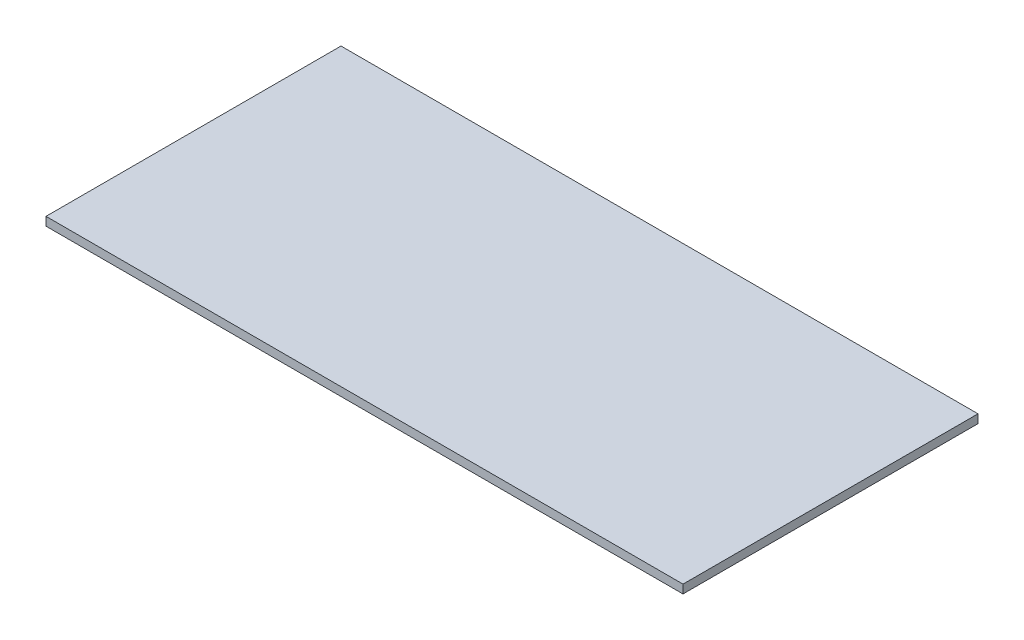
ISO-10303-21;
HEADER;
FILE_DESCRIPTION(('STEP AP214'),'2;1');
FILE_NAME('part.step','',(''),(''),'','','');
FILE_SCHEMA(('AUTOMOTIVE_DESIGN { 1 0 10303 214 1 1 1 1 }'));
ENDSEC;
DATA;
#1=APPLICATION_CONTEXT('core data for automotive mechanical design processes');
#2=APPLICATION_PROTOCOL_DEFINITION('international standard','automotive_design',2000,#1);
#3=PRODUCT_CONTEXT('',#1,'mechanical');
#4=PRODUCT('Part','Part','',(#3));
#5=PRODUCT_RELATED_PRODUCT_CATEGORY('part','',(#4));
#6=PRODUCT_DEFINITION_FORMATION('','',#4);
#7=PRODUCT_DEFINITION_CONTEXT('part definition',#1,'design');
#8=PRODUCT_DEFINITION('design','',#6,#7);
#9=PRODUCT_DEFINITION_SHAPE('','',#8);
#10=(LENGTH_UNIT() NAMED_UNIT(*) SI_UNIT(.MILLI.,.METRE.));
#11=(NAMED_UNIT(*) PLANE_ANGLE_UNIT() SI_UNIT($,.RADIAN.));
#12=(NAMED_UNIT(*) SI_UNIT($,.STERADIAN.) SOLID_ANGLE_UNIT());
#13=UNCERTAINTY_MEASURE_WITH_UNIT(LENGTH_MEASURE(1.E-05),#10,'distance_accuracy_value','');
#14=(GEOMETRIC_REPRESENTATION_CONTEXT(3) GLOBAL_UNCERTAINTY_ASSIGNED_CONTEXT((#13)) GLOBAL_UNIT_ASSIGNED_CONTEXT((#10,
#11,#12)) REPRESENTATION_CONTEXT('',''));
#15=CARTESIAN_POINT('',(0.,0.,0.));
#16=DIRECTION('',(0.,0.,1.));
#17=DIRECTION('',(1.,0.,0.));
#18=AXIS2_PLACEMENT_3D('',#15,#16,#17);
#19=CARTESIAN_POINT('',(94.615,2.54,43.815));
#20=DIRECTION('',(-1.,0.,0.));
#21=DIRECTION('',(0.,0.,1.));
#22=AXIS2_PLACEMENT_3D('',#19,#20,#21);
#23=PLANE('',#22);
#24=DIRECTION('',(0.,0.,-1.));
#25=VECTOR('',#24,1.);
#26=CARTESIAN_POINT('',(94.615,0.,43.815));
#27=LINE('',#26,#25);
#28=CARTESIAN_POINT('',(94.615,0.,43.815));
#29=VERTEX_POINT('',#28);
#30=CARTESIAN_POINT('',(94.615,0.,-43.815));
#31=VERTEX_POINT('',#30);
#32=EDGE_CURVE('E107',#29,#31,#27,.T.);
#33=ORIENTED_EDGE('',*,*,#32,.T.);
#34=DIRECTION('',(0.,-1.,0.));
#35=VECTOR('',#34,1.);
#36=CARTESIAN_POINT('',(94.615,2.54,-43.815));
#37=LINE('',#36,#35);
#38=CARTESIAN_POINT('',(94.615,2.54,-43.815));
#39=VERTEX_POINT('',#38);
#40=EDGE_CURVE('E11',#39,#31,#37,.T.);
#41=ORIENTED_EDGE('',*,*,#40,.F.);
#42=DIRECTION('',(0.,0.,-1.));
#43=VECTOR('',#42,1.);
#44=CARTESIAN_POINT('',(94.615,2.54,43.815));
#45=LINE('',#44,#43);
#46=CARTESIAN_POINT('',(94.615,2.54,43.815));
#47=VERTEX_POINT('',#46);
#48=EDGE_CURVE('E91',#47,#39,#45,.T.);
#49=ORIENTED_EDGE('',*,*,#48,.F.);
#50=DIRECTION('',(0.,-1.,0.));
#51=VECTOR('',#50,1.);
#52=CARTESIAN_POINT('',(94.615,2.54,43.815));
#53=LINE('',#52,#51);
#54=EDGE_CURVE('E103',#47,#29,#53,.T.);
#55=ORIENTED_EDGE('',*,*,#54,.T.);
#56=EDGE_LOOP('',(#33,#41,#49,#55));
#57=FACE_BOUND('',#56,.T.);
#58=ADVANCED_FACE('F39',(#57),#23,.F.);
#59=CARTESIAN_POINT('',(-94.615,2.54,-43.815));
#60=DIRECTION('',(0.,0.,1.));
#61=DIRECTION('',(1.,0.,0.));
#62=AXIS2_PLACEMENT_3D('',#59,#60,#61);
#63=PLANE('',#62);
#64=DIRECTION('',(-1.,0.,0.));
#65=VECTOR('',#64,1.);
#66=CARTESIAN_POINT('',(-94.615,0.,-43.815));
#67=LINE('',#66,#65);
#68=CARTESIAN_POINT('',(-94.615,0.,-43.815));
#69=VERTEX_POINT('',#68);
#70=EDGE_CURVE('E96',#31,#69,#67,.T.);
#71=ORIENTED_EDGE('',*,*,#70,.T.);
#72=DIRECTION('',(0.,-1.,0.));
#73=VECTOR('',#72,1.);
#74=CARTESIAN_POINT('',(-94.615,2.54,-43.815));
#75=LINE('',#74,#73);
#76=CARTESIAN_POINT('',(-94.615,2.54,-43.815));
#77=VERTEX_POINT('',#76);
#78=EDGE_CURVE('E48',#77,#69,#75,.T.);
#79=ORIENTED_EDGE('',*,*,#78,.F.);
#80=DIRECTION('',(-1.,0.,0.));
#81=VECTOR('',#80,1.);
#82=CARTESIAN_POINT('',(-94.615,2.54,-43.815));
#83=LINE('',#82,#81);
#84=EDGE_CURVE('E86',#39,#77,#83,.T.);
#85=ORIENTED_EDGE('',*,*,#84,.F.);
#86=ORIENTED_EDGE('',*,*,#40,.T.);
#87=EDGE_LOOP('',(#71,#79,#85,#86));
#88=FACE_BOUND('',#87,.T.);
#89=ADVANCED_FACE('F95',(#88),#63,.F.);
#90=CARTESIAN_POINT('',(-94.615,2.54,43.815));
#91=DIRECTION('',(1.,0.,0.));
#92=DIRECTION('',(0.,0.,-1.));
#93=AXIS2_PLACEMENT_3D('',#90,#91,#92);
#94=PLANE('',#93);
#95=DIRECTION('',(0.,0.,1.));
#96=VECTOR('',#95,1.);
#97=CARTESIAN_POINT('',(-94.615,0.,43.815));
#98=LINE('',#97,#96);
#99=CARTESIAN_POINT('',(-94.615,0.,43.815));
#100=VERTEX_POINT('',#99);
#101=EDGE_CURVE('E73',#69,#100,#98,.T.);
#102=ORIENTED_EDGE('',*,*,#101,.T.);
#103=DIRECTION('',(0.,-1.,0.));
#104=VECTOR('',#103,1.);
#105=CARTESIAN_POINT('',(-94.615,2.54,43.815));
#106=LINE('',#105,#104);
#107=CARTESIAN_POINT('',(-94.615,2.54,43.815));
#108=VERTEX_POINT('',#107);
#109=EDGE_CURVE('E98',#108,#100,#106,.T.);
#110=ORIENTED_EDGE('',*,*,#109,.F.);
#111=DIRECTION('',(0.,0.,1.));
#112=VECTOR('',#111,1.);
#113=CARTESIAN_POINT('',(-94.615,2.54,43.815));
#114=LINE('',#113,#112);
#115=EDGE_CURVE('E89',#77,#108,#114,.T.);
#116=ORIENTED_EDGE('',*,*,#115,.F.);
#117=ORIENTED_EDGE('',*,*,#78,.T.);
#118=EDGE_LOOP('',(#102,#110,#116,#117));
#119=FACE_BOUND('',#118,.T.);
#120=ADVANCED_FACE('F99',(#119),#94,.F.);
#121=CARTESIAN_POINT('',(-94.615,2.54,43.815));
#122=DIRECTION('',(0.,0.,-1.));
#123=DIRECTION('',(-1.,0.,0.));
#124=AXIS2_PLACEMENT_3D('',#121,#122,#123);
#125=PLANE('',#124);
#126=DIRECTION('',(1.,0.,0.));
#127=VECTOR('',#126,1.);
#128=CARTESIAN_POINT('',(-94.615,0.,43.815));
#129=LINE('',#128,#127);
#130=EDGE_CURVE('E79',#100,#29,#129,.T.);
#131=ORIENTED_EDGE('',*,*,#130,.T.);
#132=ORIENTED_EDGE('',*,*,#54,.F.);
#133=DIRECTION('',(1.,0.,0.));
#134=VECTOR('',#133,1.);
#135=CARTESIAN_POINT('',(-94.615,2.54,43.815));
#136=LINE('',#135,#134);
#137=EDGE_CURVE('E56',#108,#47,#136,.T.);
#138=ORIENTED_EDGE('',*,*,#137,.F.);
#139=ORIENTED_EDGE('',*,*,#109,.T.);
#140=EDGE_LOOP('',(#131,#132,#138,#139));
#141=FACE_BOUND('',#140,.T.);
#142=ADVANCED_FACE('F120',(#141),#125,.F.);
#143=CARTESIAN_POINT('',(0.,2.54,0.));
#144=DIRECTION('',(0.,-1.,0.));
#145=DIRECTION('',(0.,0.,-1.));
#146=AXIS2_PLACEMENT_3D('',#143,#144,#145);
#147=PLANE('',#146);
#148=ORIENTED_EDGE('',*,*,#48,.T.);
#149=ORIENTED_EDGE('',*,*,#84,.T.);
#150=ORIENTED_EDGE('',*,*,#115,.T.);
#151=ORIENTED_EDGE('',*,*,#137,.T.);
#152=EDGE_LOOP('',(#148,#149,#150,#151));
#153=FACE_BOUND('',#152,.T.);
#154=ADVANCED_FACE('F87',(#153),#147,.F.);
#155=CARTESIAN_POINT('',(0.,0.,0.));
#156=DIRECTION('',(0.,-1.,0.));
#157=DIRECTION('',(0.,0.,-1.));
#158=AXIS2_PLACEMENT_3D('',#155,#156,#157);
#159=PLANE('',#158);
#160=ORIENTED_EDGE('',*,*,#32,.F.);
#161=ORIENTED_EDGE('',*,*,#130,.F.);
#162=ORIENTED_EDGE('',*,*,#101,.F.);
#163=ORIENTED_EDGE('',*,*,#70,.F.);
#164=EDGE_LOOP('',(#160,#161,#162,#163));
#165=FACE_BOUND('',#164,.T.);
#166=ADVANCED_FACE('F123',(#165),#159,.T.);
#167=CLOSED_SHELL('',(#58,#89,#120,#142,#154,#166));
#168=MANIFOLD_SOLID_BREP('B2',#167);
#169=ADVANCED_BREP_SHAPE_REPRESENTATION('',(#18,#168),#14);
#170=SHAPE_DEFINITION_REPRESENTATION(#9,#169);
ENDSEC;
END-ISO-10303-21;
